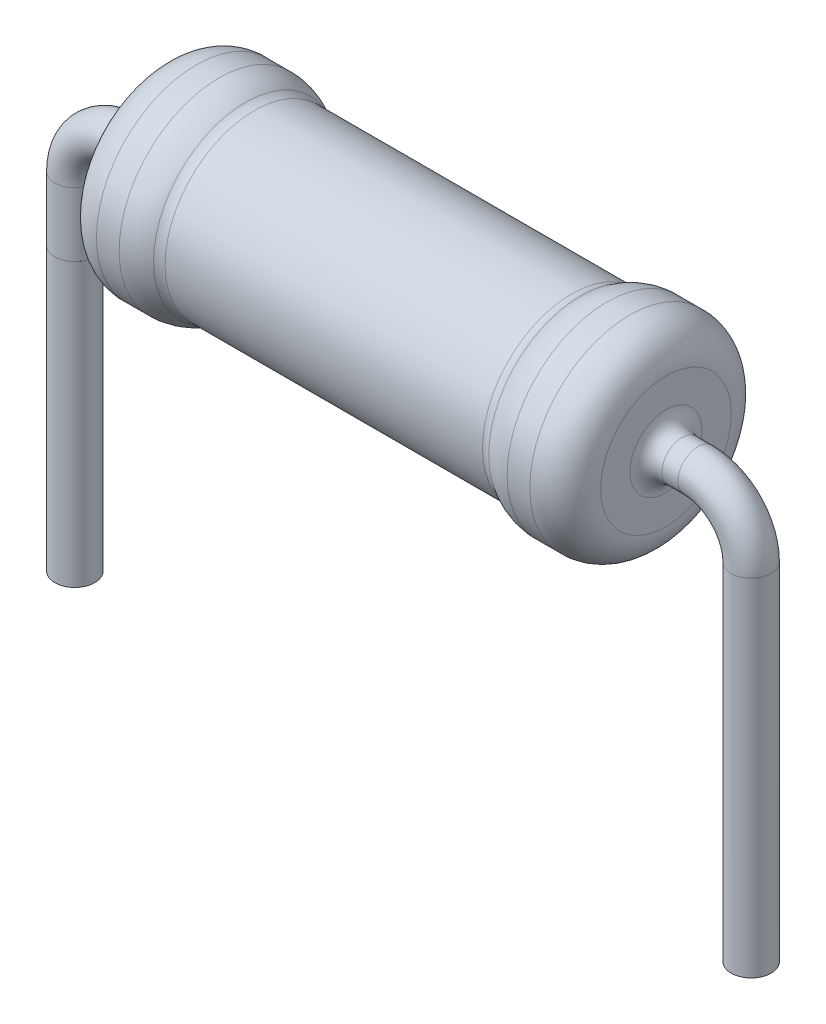
ISO-10303-21;
HEADER;
FILE_DESCRIPTION(('STEP AP214'),'2;1');
FILE_NAME('part.step','',(''),(''),'','','');
FILE_SCHEMA(('AUTOMOTIVE_DESIGN { 1 0 10303 214 1 1 1 1 }'));
ENDSEC;
DATA;
#1=APPLICATION_CONTEXT('core data for automotive mechanical design processes');
#2=APPLICATION_PROTOCOL_DEFINITION('international standard','automotive_design',2000,#1);
#3=PRODUCT_CONTEXT('',#1,'mechanical');
#4=PRODUCT('Part','Part','',(#3));
#5=PRODUCT_RELATED_PRODUCT_CATEGORY('part','',(#4));
#6=PRODUCT_DEFINITION_FORMATION('','',#4);
#7=PRODUCT_DEFINITION_CONTEXT('part definition',#1,'design');
#8=PRODUCT_DEFINITION('design','',#6,#7);
#9=PRODUCT_DEFINITION_SHAPE('','',#8);
#10=(LENGTH_UNIT() NAMED_UNIT(*) SI_UNIT(.MILLI.,.METRE.));
#11=(NAMED_UNIT(*) PLANE_ANGLE_UNIT() SI_UNIT($,.RADIAN.));
#12=(NAMED_UNIT(*) SI_UNIT($,.STERADIAN.) SOLID_ANGLE_UNIT());
#13=UNCERTAINTY_MEASURE_WITH_UNIT(LENGTH_MEASURE(1.E-05),#10,'distance_accuracy_value','');
#14=(GEOMETRIC_REPRESENTATION_CONTEXT(3) GLOBAL_UNCERTAINTY_ASSIGNED_CONTEXT((#13)) GLOBAL_UNIT_ASSIGNED_CONTEXT((#10,
#11,#12)) REPRESENTATION_CONTEXT('',''));
#15=CARTESIAN_POINT('',(0.,0.,0.));
#16=DIRECTION('',(0.,0.,1.));
#17=DIRECTION('',(1.,0.,0.));
#18=AXIS2_PLACEMENT_3D('',#15,#16,#17);
#19=CARTESIAN_POINT('',(-4.75,0.,0.));
#20=DIRECTION('',(-1.,0.,0.));
#21=DIRECTION('',(0.,0.,1.));
#22=AXIS2_PLACEMENT_3D('',#19,#20,#21);
#23=PLANE('',#22);
#24=CARTESIAN_POINT('',(-4.75,7.5,0.));
#25=DIRECTION('',(-1.,0.,0.));
#26=DIRECTION('',(0.,0.,1.));
#27=AXIS2_PLACEMENT_3D('',#24,#25,#26);
#28=CIRCLE('',#27,0.675);
#29=CARTESIAN_POINT('',(-4.75,7.5,0.675));
#30=VERTEX_POINT('',#29);
#31=EDGE_CURVE('E49',#30,#30,#28,.F.);
#32=ORIENTED_EDGE('',*,*,#31,.T.);
#33=EDGE_LOOP('',(#32));
#34=FACE_BOUND('',#33,.T.);
#35=CARTESIAN_POINT('',(-4.75,7.5,0.));
#36=DIRECTION('',(-1.,0.,0.));
#37=DIRECTION('',(0.,0.,1.));
#38=AXIS2_PLACEMENT_3D('',#35,#36,#37);
#39=CIRCLE('',#38,1.22576205691927);
#40=CARTESIAN_POINT('',(-4.75,7.5,1.22576205691927));
#41=VERTEX_POINT('',#40);
#42=EDGE_CURVE('E98',#41,#41,#39,.T.);
#43=ORIENTED_EDGE('',*,*,#42,.T.);
#44=EDGE_LOOP('',(#43));
#45=FACE_BOUND('',#44,.T.);
#46=ADVANCED_FACE('F42',(#34,#45),#23,.T.);
#47=CARTESIAN_POINT('',(6.35,5.3,0.));
#48=DIRECTION('',(0.,-1.,0.));
#49=DIRECTION('',(0.,0.,-1.));
#50=AXIS2_PLACEMENT_3D('',#47,#48,#49);
#51=CYLINDRICAL_SURFACE('',#50,0.375);
#52=CARTESIAN_POINT('',(6.35,0.,0.));
#53=DIRECTION('',(0.,1.,0.));
#54=DIRECTION('',(0.,0.,-1.));
#55=AXIS2_PLACEMENT_3D('',#52,#53,#54);
#56=CIRCLE('',#55,0.375);
#57=CARTESIAN_POINT('',(6.35,0.,-0.374999999999999));
#58=VERTEX_POINT('',#57);
#59=EDGE_CURVE('E62',#58,#58,#56,.T.);
#60=ORIENTED_EDGE('',*,*,#59,.T.);
#61=EDGE_LOOP('',(#60));
#62=FACE_BOUND('',#61,.T.);
#63=CARTESIAN_POINT('',(6.35,6.5,0.));
#64=DIRECTION('',(0.,1.,0.));
#65=DIRECTION('',(0.,0.,1.));
#66=AXIS2_PLACEMENT_3D('',#63,#64,#65);
#67=CIRCLE('',#66,0.375);
#68=CARTESIAN_POINT('',(6.725,6.5,0.));
#69=VERTEX_POINT('',#68);
#70=EDGE_CURVE('E68',#69,#69,#67,.T.);
#71=ORIENTED_EDGE('',*,*,#70,.F.);
#72=EDGE_LOOP('',(#71));
#73=FACE_BOUND('',#72,.T.);
#74=ADVANCED_FACE('F132',(#62,#73),#51,.T.);
#75=CARTESIAN_POINT('',(6.35,0.,0.));
#76=DIRECTION('',(0.,-1.,0.));
#77=DIRECTION('',(0.,0.,-1.));
#78=AXIS2_PLACEMENT_3D('',#75,#76,#77);
#79=PLANE('',#78);
#80=ORIENTED_EDGE('',*,*,#59,.F.);
#81=EDGE_LOOP('',(#80));
#82=FACE_BOUND('',#81,.T.);
#83=ADVANCED_FACE('F136',(#82),#79,.T.);
#84=CARTESIAN_POINT('',(5.35,7.5,0.));
#85=DIRECTION('',(-1.,0.,0.));
#86=DIRECTION('',(0.,0.,1.));
#87=AXIS2_PLACEMENT_3D('',#84,#85,#86);
#88=CYLINDRICAL_SURFACE('',#87,0.375);
#89=CARTESIAN_POINT('',(5.05,7.5,0.));
#90=DIRECTION('',(1.,0.,0.));
#91=DIRECTION('',(0.,0.,-1.));
#92=AXIS2_PLACEMENT_3D('',#89,#90,#91);
#93=CIRCLE('',#92,0.375);
#94=CARTESIAN_POINT('',(5.05,7.5,-0.375));
#95=VERTEX_POINT('',#94);
#96=EDGE_CURVE('E53',#95,#95,#93,.T.);
#97=ORIENTED_EDGE('',*,*,#96,.T.);
#98=EDGE_LOOP('',(#97));
#99=FACE_BOUND('',#98,.T.);
#100=CARTESIAN_POINT('',(5.35,7.5,0.));
#101=DIRECTION('',(-1.,0.,0.));
#102=DIRECTION('',(0.,0.,1.));
#103=AXIS2_PLACEMENT_3D('',#100,#101,#102);
#104=CIRCLE('',#103,0.375);
#105=CARTESIAN_POINT('',(5.35,7.875,0.));
#106=VERTEX_POINT('',#105);
#107=EDGE_CURVE('E65',#106,#106,#104,.T.);
#108=ORIENTED_EDGE('',*,*,#107,.T.);
#109=EDGE_LOOP('',(#108));
#110=FACE_BOUND('',#109,.T.);
#111=ADVANCED_FACE('F179',(#99,#110),#88,.T.);
#112=CARTESIAN_POINT('',(5.35,6.5,0.));
#113=DIRECTION('',(0.,0.,1.));
#114=DIRECTION('',(1.,0.,0.));
#115=AXIS2_PLACEMENT_3D('',#112,#113,#114);
#116=TOROIDAL_SURFACE('',#115,1.,0.375);
#117=CARTESIAN_POINT('',(5.35,6.5,0.));
#118=DIRECTION('',(0.,0.,1.));
#119=DIRECTION('',(1.,0.,0.));
#120=AXIS2_PLACEMENT_3D('',#117,#118,#119);
#121=CIRCLE('',#120,1.375);
#122=EDGE_CURVE('',#69,#106,#121,.T.);
#123=ORIENTED_EDGE('',*,*,#70,.T.);
#124=ORIENTED_EDGE('',*,*,#107,.F.);
#125=ORIENTED_EDGE('',*,*,#122,.T.);
#126=ORIENTED_EDGE('',*,*,#122,.F.);
#127=EDGE_LOOP('',(#123,#125,#124,#126));
#128=FACE_BOUND('',#127,.T.);
#129=ADVANCED_FACE('F175',(#128),#116,.T.);
#130=CARTESIAN_POINT('',(4.75,0.,0.));
#131=DIRECTION('',(1.,0.,0.));
#132=DIRECTION('',(0.,0.,-1.));
#133=AXIS2_PLACEMENT_3D('',#130,#131,#132);
#134=PLANE('',#133);
#135=CARTESIAN_POINT('',(4.75,7.5,0.));
#136=DIRECTION('',(1.,0.,0.));
#137=DIRECTION('',(0.,0.,-1.));
#138=AXIS2_PLACEMENT_3D('',#135,#136,#137);
#139=CIRCLE('',#138,0.675);
#140=CARTESIAN_POINT('',(4.75,7.5,-0.675));
#141=VERTEX_POINT('',#140);
#142=EDGE_CURVE('E57',#141,#141,#139,.F.);
#143=ORIENTED_EDGE('',*,*,#142,.T.);
#144=EDGE_LOOP('',(#143));
#145=FACE_BOUND('',#144,.T.);
#146=CARTESIAN_POINT('',(4.75,7.5,0.));
#147=DIRECTION('',(-1.,0.,0.));
#148=DIRECTION('',(0.,0.,1.));
#149=AXIS2_PLACEMENT_3D('',#146,#147,#148);
#150=CIRCLE('',#149,1.22576205691927);
#151=CARTESIAN_POINT('',(4.75,7.5,1.22576205691927));
#152=VERTEX_POINT('',#151);
#153=EDGE_CURVE('E71',#152,#152,#150,.T.);
#154=ORIENTED_EDGE('',*,*,#153,.F.);
#155=EDGE_LOOP('',(#154));
#156=FACE_BOUND('',#155,.T.);
#157=ADVANCED_FACE('F171',(#145,#156),#134,.T.);
#158=CARTESIAN_POINT('',(4.1,7.5,0.));
#159=DIRECTION('',(-1.,0.,0.));
#160=DIRECTION('',(0.,0.,1.));
#161=AXIS2_PLACEMENT_3D('',#158,#159,#160);
#162=TOROIDAL_SURFACE('',#161,1.22576205691928,0.65);
#163=CARTESIAN_POINT('',(4.06853425252267,7.5,0.));
#164=DIRECTION('',(-1.,0.,0.));
#165=DIRECTION('',(0.,0.,1.));
#166=AXIS2_PLACEMENT_3D('',#163,#164,#165);
#167=CIRCLE('',#166,1.87500000000001);
#168=CARTESIAN_POINT('',(4.06853425252267,7.5,1.87500000000001));
#169=VERTEX_POINT('',#168);
#170=EDGE_CURVE('E74',#169,#169,#167,.T.);
#171=ORIENTED_EDGE('',*,*,#170,.F.);
#172=EDGE_LOOP('',(#171));
#173=FACE_BOUND('',#172,.T.);
#174=ORIENTED_EDGE('',*,*,#153,.T.);
#175=EDGE_LOOP('',(#174));
#176=FACE_BOUND('',#175,.T.);
#177=ADVANCED_FACE('F167',(#173,#176),#162,.T.);
#178=CARTESIAN_POINT('',(-4.75,7.5,0.));
#179=DIRECTION('',(-1.,0.,0.));
#180=DIRECTION('',(0.,0.,1.));
#181=AXIS2_PLACEMENT_3D('',#178,#179,#180);
#182=CYLINDRICAL_SURFACE('',#181,1.875);
#183=ORIENTED_EDGE('',*,*,#170,.T.);
#184=EDGE_LOOP('',(#183));
#185=FACE_BOUND('',#184,.T.);
#186=CARTESIAN_POINT('',(3.64302352755487,7.5,0.));
#187=DIRECTION('',(-1.,0.,0.));
#188=DIRECTION('',(0.,0.,1.));
#189=AXIS2_PLACEMENT_3D('',#186,#187,#188);
#190=CIRCLE('',#189,1.875);
#191=CARTESIAN_POINT('',(3.64302352755487,7.5,1.875));
#192=VERTEX_POINT('',#191);
#193=EDGE_CURVE('E77',#192,#192,#190,.T.);
#194=ORIENTED_EDGE('',*,*,#193,.F.);
#195=EDGE_LOOP('',(#194));
#196=FACE_BOUND('',#195,.T.);
#197=ADVANCED_FACE('F163',(#185,#196),#182,.T.);
#198=CARTESIAN_POINT('',(3.64302352755487,7.5,0.));
#199=DIRECTION('',(-1.,0.,0.));
#200=DIRECTION('',(0.,0.,1.));
#201=AXIS2_PLACEMENT_3D('',#198,#199,#200);
#202=TOROIDAL_SURFACE('',#201,0.977263692076678,0.89773630792332);
#203=CARTESIAN_POINT('',(3.14635506355775,7.5,0.));
#204=DIRECTION('',(-1.,0.,0.));
#205=DIRECTION('',(0.,0.,1.));
#206=AXIS2_PLACEMENT_3D('',#203,#204,#205);
#207=CIRCLE('',#206,1.72509449876662);
#208=CARTESIAN_POINT('',(3.14635506355775,7.5,1.72509449876662));
#209=VERTEX_POINT('',#208);
#210=EDGE_CURVE('E80',#209,#209,#207,.T.);
#211=ORIENTED_EDGE('',*,*,#210,.F.);
#212=EDGE_LOOP('',(#211));
#213=FACE_BOUND('',#212,.T.);
#214=ORIENTED_EDGE('',*,*,#193,.T.);
#215=EDGE_LOOP('',(#214));
#216=FACE_BOUND('',#215,.T.);
#217=ADVANCED_FACE('F159',(#213,#216),#202,.T.);
#218=CARTESIAN_POINT('',(2.98038144983167,7.5,0.));
#219=DIRECTION('',(-1.,0.,0.));
#220=DIRECTION('',(0.,0.,1.));
#221=AXIS2_PLACEMENT_3D('',#218,#219,#220);
#222=TOROIDAL_SURFACE('',#221,1.975,0.3);
#223=ORIENTED_EDGE('',*,*,#210,.T.);
#224=EDGE_LOOP('',(#223));
#225=FACE_BOUND('',#224,.T.);
#226=CARTESIAN_POINT('',(2.98038144983167,7.5,0.));
#227=DIRECTION('',(-1.,0.,0.));
#228=DIRECTION('',(0.,0.,1.));
#229=AXIS2_PLACEMENT_3D('',#226,#227,#228);
#230=CIRCLE('',#229,1.675);
#231=CARTESIAN_POINT('',(2.98038144983167,7.5,1.675));
#232=VERTEX_POINT('',#231);
#233=EDGE_CURVE('E83',#232,#232,#230,.T.);
#234=ORIENTED_EDGE('',*,*,#233,.F.);
#235=EDGE_LOOP('',(#234));
#236=FACE_BOUND('',#235,.T.);
#237=ADVANCED_FACE('F155',(#225,#236),#222,.F.);
#238=CARTESIAN_POINT('',(-4.75,7.5,0.));
#239=DIRECTION('',(-1.,0.,0.));
#240=DIRECTION('',(0.,0.,1.));
#241=AXIS2_PLACEMENT_3D('',#238,#239,#240);
#242=CYLINDRICAL_SURFACE('',#241,1.675);
#243=ORIENTED_EDGE('',*,*,#233,.T.);
#244=EDGE_LOOP('',(#243));
#245=FACE_BOUND('',#244,.T.);
#246=CARTESIAN_POINT('',(-2.98038144983167,7.5,0.));
#247=DIRECTION('',(-1.,0.,0.));
#248=DIRECTION('',(0.,0.,1.));
#249=AXIS2_PLACEMENT_3D('',#246,#247,#248);
#250=CIRCLE('',#249,1.675);
#251=CARTESIAN_POINT('',(-2.98038144983167,7.5,1.675));
#252=VERTEX_POINT('',#251);
#253=EDGE_CURVE('E86',#252,#252,#250,.T.);
#254=ORIENTED_EDGE('',*,*,#253,.F.);
#255=EDGE_LOOP('',(#254));
#256=FACE_BOUND('',#255,.T.);
#257=ADVANCED_FACE('F151',(#245,#256),#242,.T.);
#258=CARTESIAN_POINT('',(-2.98038144983167,7.5,0.));
#259=DIRECTION('',(-1.,0.,0.));
#260=DIRECTION('',(0.,0.,1.));
#261=AXIS2_PLACEMENT_3D('',#258,#259,#260);
#262=TOROIDAL_SURFACE('',#261,1.975,0.3);
#263=CARTESIAN_POINT('',(-3.14635506355775,7.5,0.));
#264=DIRECTION('',(-1.,0.,0.));
#265=DIRECTION('',(0.,0.,1.));
#266=AXIS2_PLACEMENT_3D('',#263,#264,#265);
#267=CIRCLE('',#266,1.72509449876662);
#268=CARTESIAN_POINT('',(-3.14635506355775,7.5,1.72509449876662));
#269=VERTEX_POINT('',#268);
#270=EDGE_CURVE('E89',#269,#269,#267,.T.);
#271=ORIENTED_EDGE('',*,*,#270,.F.);
#272=EDGE_LOOP('',(#271));
#273=FACE_BOUND('',#272,.T.);
#274=ORIENTED_EDGE('',*,*,#253,.T.);
#275=EDGE_LOOP('',(#274));
#276=FACE_BOUND('',#275,.T.);
#277=ADVANCED_FACE('F147',(#273,#276),#262,.F.);
#278=CARTESIAN_POINT('',(-3.64302352755487,7.5,0.));
#279=DIRECTION('',(-1.,0.,0.));
#280=DIRECTION('',(0.,0.,1.));
#281=AXIS2_PLACEMENT_3D('',#278,#279,#280);
#282=TOROIDAL_SURFACE('',#281,0.977263692076678,0.89773630792332);
#283=ORIENTED_EDGE('',*,*,#270,.T.);
#284=EDGE_LOOP('',(#283));
#285=FACE_BOUND('',#284,.T.);
#286=CARTESIAN_POINT('',(-3.64302352755487,7.5,0.));
#287=DIRECTION('',(-1.,0.,0.));
#288=DIRECTION('',(0.,0.,1.));
#289=AXIS2_PLACEMENT_3D('',#286,#287,#288);
#290=CIRCLE('',#289,1.875);
#291=CARTESIAN_POINT('',(-3.64302352755487,7.5,1.875));
#292=VERTEX_POINT('',#291);
#293=EDGE_CURVE('E92',#292,#292,#290,.T.);
#294=ORIENTED_EDGE('',*,*,#293,.F.);
#295=EDGE_LOOP('',(#294));
#296=FACE_BOUND('',#295,.T.);
#297=ADVANCED_FACE('F143',(#285,#296),#282,.T.);
#298=CARTESIAN_POINT('',(-4.75,7.5,0.));
#299=DIRECTION('',(-1.,0.,0.));
#300=DIRECTION('',(0.,0.,1.));
#301=AXIS2_PLACEMENT_3D('',#298,#299,#300);
#302=CYLINDRICAL_SURFACE('',#301,1.875);
#303=ORIENTED_EDGE('',*,*,#293,.T.);
#304=EDGE_LOOP('',(#303));
#305=FACE_BOUND('',#304,.T.);
#306=CARTESIAN_POINT('',(-4.06853425252267,7.5,0.));
#307=DIRECTION('',(-1.,0.,0.));
#308=DIRECTION('',(0.,0.,1.));
#309=AXIS2_PLACEMENT_3D('',#306,#307,#308);
#310=CIRCLE('',#309,1.87500000000001);
#311=CARTESIAN_POINT('',(-4.06853425252267,7.5,1.87500000000001));
#312=VERTEX_POINT('',#311);
#313=EDGE_CURVE('E95',#312,#312,#310,.T.);
#314=ORIENTED_EDGE('',*,*,#313,.F.);
#315=EDGE_LOOP('',(#314));
#316=FACE_BOUND('',#315,.T.);
#317=ADVANCED_FACE('F127',(#305,#316),#302,.T.);
#318=CARTESIAN_POINT('',(-4.1,7.5,0.));
#319=DIRECTION('',(-1.,0.,0.));
#320=DIRECTION('',(0.,0.,1.));
#321=AXIS2_PLACEMENT_3D('',#318,#319,#320);
#322=TOROIDAL_SURFACE('',#321,1.22576205691928,0.65);
#323=ORIENTED_EDGE('',*,*,#313,.T.);
#324=EDGE_LOOP('',(#323));
#325=FACE_BOUND('',#324,.T.);
#326=ORIENTED_EDGE('',*,*,#42,.F.);
#327=EDGE_LOOP('',(#326));
#328=FACE_BOUND('',#327,.T.);
#329=ADVANCED_FACE('F122',(#325,#328),#322,.T.);
#330=CARTESIAN_POINT('',(-5.35,7.5,0.));
#331=DIRECTION('',(1.,0.,0.));
#332=DIRECTION('',(0.,0.,-1.));
#333=AXIS2_PLACEMENT_3D('',#330,#331,#332);
#334=CYLINDRICAL_SURFACE('',#333,0.375);
#335=CARTESIAN_POINT('',(-5.05,7.5,0.));
#336=DIRECTION('',(-1.,0.,0.));
#337=DIRECTION('',(0.,0.,1.));
#338=AXIS2_PLACEMENT_3D('',#335,#336,#337);
#339=CIRCLE('',#338,0.375);
#340=CARTESIAN_POINT('',(-5.05,7.5,0.375));
#341=VERTEX_POINT('',#340);
#342=EDGE_CURVE('E11',#341,#341,#339,.T.);
#343=ORIENTED_EDGE('',*,*,#342,.T.);
#344=EDGE_LOOP('',(#343));
#345=FACE_BOUND('',#344,.T.);
#346=CARTESIAN_POINT('',(-5.35,7.5,0.));
#347=DIRECTION('',(-1.,0.,0.));
#348=DIRECTION('',(0.,0.,1.));
#349=AXIS2_PLACEMENT_3D('',#346,#347,#348);
#350=CIRCLE('',#349,0.375);
#351=CARTESIAN_POINT('',(-5.35,7.875,0.));
#352=VERTEX_POINT('',#351);
#353=EDGE_CURVE('E101',#352,#352,#350,.T.);
#354=ORIENTED_EDGE('',*,*,#353,.F.);
#355=EDGE_LOOP('',(#354));
#356=FACE_BOUND('',#355,.T.);
#357=ADVANCED_FACE('F117',(#345,#356),#334,.T.);
#358=CARTESIAN_POINT('',(-5.35,6.5,0.));
#359=DIRECTION('',(0.,0.,-1.));
#360=DIRECTION('',(-1.,0.,0.));
#361=AXIS2_PLACEMENT_3D('',#358,#359,#360);
#362=TOROIDAL_SURFACE('',#361,1.,0.375);
#363=CARTESIAN_POINT('',(-6.35,6.5,0.));
#364=DIRECTION('',(0.,-1.,0.));
#365=DIRECTION('',(0.,0.,1.));
#366=AXIS2_PLACEMENT_3D('',#363,#364,#365);
#367=CIRCLE('',#366,0.375);
#368=CARTESIAN_POINT('',(-6.725,6.5,0.));
#369=VERTEX_POINT('',#368);
#370=EDGE_CURVE('E104',#369,#369,#367,.T.);
#371=CARTESIAN_POINT('',(-5.35,6.5,0.));
#372=DIRECTION('',(0.,0.,-1.));
#373=DIRECTION('',(-1.,0.,0.));
#374=AXIS2_PLACEMENT_3D('',#371,#372,#373);
#375=CIRCLE('',#374,1.375);
#376=EDGE_CURVE('',#369,#352,#375,.T.);
#377=ORIENTED_EDGE('',*,*,#370,.F.);
#378=ORIENTED_EDGE('',*,*,#353,.T.);
#379=ORIENTED_EDGE('',*,*,#376,.T.);
#380=ORIENTED_EDGE('',*,*,#376,.F.);
#381=EDGE_LOOP('',(#377,#379,#378,#380));
#382=FACE_BOUND('',#381,.T.);
#383=ADVANCED_FACE('F114',(#382),#362,.T.);
#384=CARTESIAN_POINT('',(-6.35,6.5,0.));
#385=DIRECTION('',(0.,-1.,0.));
#386=DIRECTION('',(0.,0.,-1.));
#387=AXIS2_PLACEMENT_3D('',#384,#385,#386);
#388=CYLINDRICAL_SURFACE('',#387,0.375);
#389=ORIENTED_EDGE('',*,*,#370,.T.);
#390=EDGE_LOOP('',(#389));
#391=FACE_BOUND('',#390,.T.);
#392=CARTESIAN_POINT('',(-6.35,5.3,0.));
#393=DIRECTION('',(0.,-1.,0.));
#394=DIRECTION('',(0.,0.,1.));
#395=AXIS2_PLACEMENT_3D('',#392,#393,#394);
#396=CIRCLE('',#395,0.375);
#397=CARTESIAN_POINT('',(-6.35,5.3,0.375));
#398=VERTEX_POINT('',#397);
#399=EDGE_CURVE('E105',#398,#398,#396,.T.);
#400=ORIENTED_EDGE('',*,*,#399,.F.);
#401=EDGE_LOOP('',(#400));
#402=FACE_BOUND('',#401,.T.);
#403=ADVANCED_FACE('F111',(#391,#402),#388,.T.);
#404=CARTESIAN_POINT('',(-6.35,5.3,0.));
#405=DIRECTION('',(0.,1.,0.));
#406=DIRECTION('',(0.,0.,1.));
#407=AXIS2_PLACEMENT_3D('',#404,#405,#406);
#408=PLANE('',#407);
#409=ORIENTED_EDGE('',*,*,#399,.T.);
#410=EDGE_LOOP('',(#409));
#411=FACE_BOUND('',#410,.T.);
#412=ADVANCED_FACE('F188',(#411),#408,.F.);
#413=CARTESIAN_POINT('',(5.05,7.5,0.));
#414=DIRECTION('',(1.,0.,0.));
#415=DIRECTION('',(0.,0.,-1.));
#416=AXIS2_PLACEMENT_3D('',#413,#414,#415);
#417=TOROIDAL_SURFACE('',#416,0.675,0.3);
#418=ORIENTED_EDGE('',*,*,#96,.F.);
#419=EDGE_LOOP('',(#418));
#420=FACE_BOUND('',#419,.T.);
#421=ORIENTED_EDGE('',*,*,#142,.F.);
#422=EDGE_LOOP('',(#421));
#423=FACE_BOUND('',#422,.T.);
#424=ADVANCED_FACE('F186',(#420,#423),#417,.F.);
#425=CARTESIAN_POINT('',(-5.05,7.5,0.));
#426=DIRECTION('',(-1.,0.,0.));
#427=DIRECTION('',(0.,0.,1.));
#428=AXIS2_PLACEMENT_3D('',#425,#426,#427);
#429=TOROIDAL_SURFACE('',#428,0.675,0.3);
#430=ORIENTED_EDGE('',*,*,#342,.F.);
#431=EDGE_LOOP('',(#430));
#432=FACE_BOUND('',#431,.T.);
#433=ORIENTED_EDGE('',*,*,#31,.F.);
#434=EDGE_LOOP('',(#433));
#435=FACE_BOUND('',#434,.T.);
#436=ADVANCED_FACE('F44',(#432,#435),#429,.F.);
#437=CLOSED_SHELL('',(#46,#74,#83,#111,#129,#157,#177,#197,#217,#237,#257,#277,#297,#317,#329,
#357,#383,#403,#412,#424,#436));
#438=MANIFOLD_SOLID_BREP('B2',#437);
#439=CARTESIAN_POINT('',(-6.35,5.3,0.));
#440=DIRECTION('',(0.,-1.,0.));
#441=DIRECTION('',(0.,0.,-1.));
#442=AXIS2_PLACEMENT_3D('',#439,#440,#441);
#443=CYLINDRICAL_SURFACE('',#442,0.375);
#444=CARTESIAN_POINT('',(-6.35,5.3,0.));
#445=DIRECTION('',(0.,1.,0.));
#446=DIRECTION('',(0.,0.,1.));
#447=AXIS2_PLACEMENT_3D('',#444,#445,#446);
#448=CIRCLE('',#447,0.375);
#449=CARTESIAN_POINT('',(-6.35,5.3,0.375000000000002));
#450=VERTEX_POINT('',#449);
#451=EDGE_CURVE('E41',#450,#450,#448,.T.);
#452=ORIENTED_EDGE('',*,*,#451,.F.);
#453=EDGE_LOOP('',(#452));
#454=FACE_BOUND('',#453,.T.);
#455=CARTESIAN_POINT('',(-6.35,0.,0.));
#456=DIRECTION('',(0.,1.,0.));
#457=DIRECTION('',(0.,0.,1.));
#458=AXIS2_PLACEMENT_3D('',#455,#456,#457);
#459=CIRCLE('',#458,0.375);
#460=CARTESIAN_POINT('',(-6.35,0.,0.375000000000002));
#461=VERTEX_POINT('',#460);
#462=EDGE_CURVE('E364',#461,#461,#459,.T.);
#463=ORIENTED_EDGE('',*,*,#462,.T.);
#464=EDGE_LOOP('',(#463));
#465=FACE_BOUND('',#464,.T.);
#466=ADVANCED_FACE('F361',(#454,#465),#443,.T.);
#467=CARTESIAN_POINT('',(-6.35,5.3,0.));
#468=DIRECTION('',(0.,1.,0.));
#469=DIRECTION('',(0.,0.,1.));
#470=AXIS2_PLACEMENT_3D('',#467,#468,#469);
#471=PLANE('',#470);
#472=ORIENTED_EDGE('',*,*,#451,.T.);
#473=EDGE_LOOP('',(#472));
#474=FACE_BOUND('',#473,.T.);
#475=ADVANCED_FACE('F376',(#474),#471,.T.);
#476=CARTESIAN_POINT('',(-6.35,0.,0.));
#477=DIRECTION('',(0.,1.,0.));
#478=DIRECTION('',(0.,0.,1.));
#479=AXIS2_PLACEMENT_3D('',#476,#477,#478);
#480=PLANE('',#479);
#481=ORIENTED_EDGE('',*,*,#462,.F.);
#482=EDGE_LOOP('',(#481));
#483=FACE_BOUND('',#482,.T.);
#484=ADVANCED_FACE('F374',(#483),#480,.F.);
#485=CLOSED_SHELL('',(#466,#475,#484));
#486=MANIFOLD_SOLID_BREP('B6',#485);
#487=ADVANCED_BREP_SHAPE_REPRESENTATION('',(#18,#438,#486),#14);
#488=SHAPE_DEFINITION_REPRESENTATION(#9,#487);
ENDSEC;
END-ISO-10303-21;
